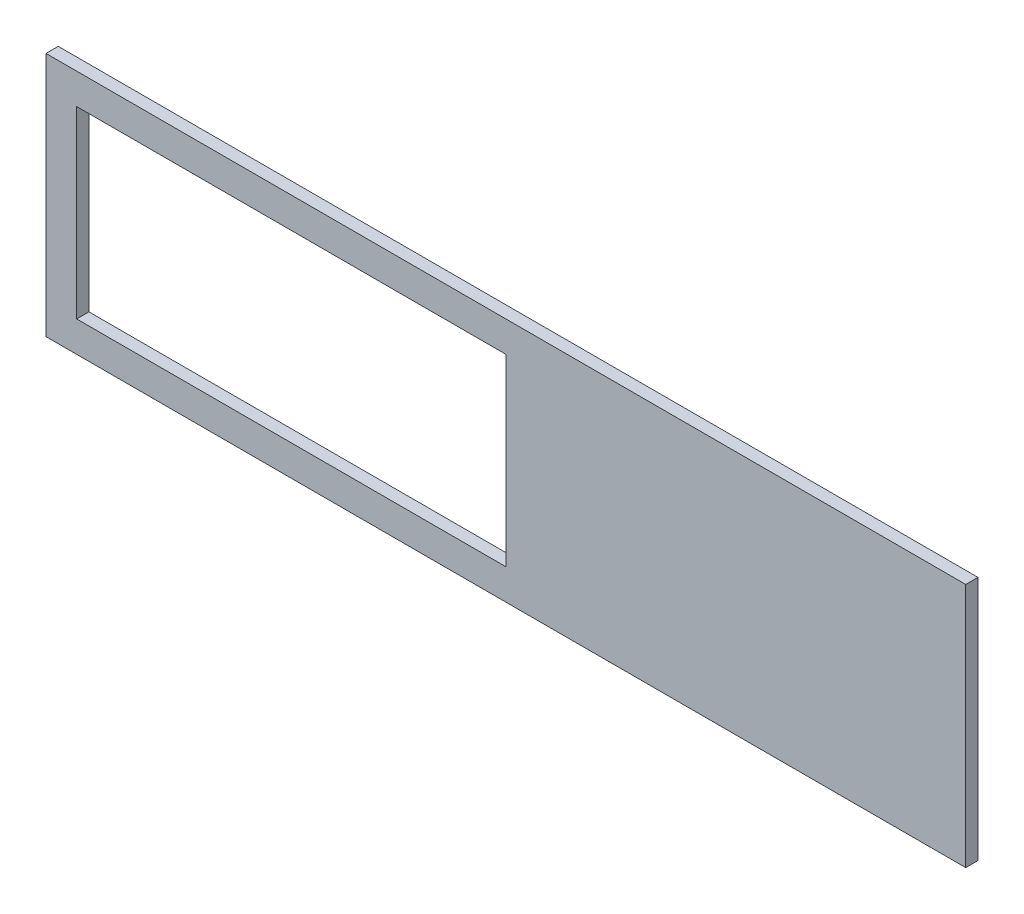
ISO-10303-21;
HEADER;
FILE_DESCRIPTION(('STEP AP214'),'2;1');
FILE_NAME('part.step','',(''),(''),'','','');
FILE_SCHEMA(('AUTOMOTIVE_DESIGN { 1 0 10303 214 1 1 1 1 }'));
ENDSEC;
DATA;
#1=APPLICATION_CONTEXT('core data for automotive mechanical design processes');
#2=APPLICATION_PROTOCOL_DEFINITION('international standard','automotive_design',2000,#1);
#3=PRODUCT_CONTEXT('',#1,'mechanical');
#4=PRODUCT('Part','Part','',(#3));
#5=PRODUCT_RELATED_PRODUCT_CATEGORY('part','',(#4));
#6=PRODUCT_DEFINITION_FORMATION('','',#4);
#7=PRODUCT_DEFINITION_CONTEXT('part definition',#1,'design');
#8=PRODUCT_DEFINITION('design','',#6,#7);
#9=PRODUCT_DEFINITION_SHAPE('','',#8);
#10=(LENGTH_UNIT() NAMED_UNIT(*) SI_UNIT(.MILLI.,.METRE.));
#11=(NAMED_UNIT(*) PLANE_ANGLE_UNIT() SI_UNIT($,.RADIAN.));
#12=(NAMED_UNIT(*) SI_UNIT($,.STERADIAN.) SOLID_ANGLE_UNIT());
#13=UNCERTAINTY_MEASURE_WITH_UNIT(LENGTH_MEASURE(1.E-05),#10,'distance_accuracy_value','');
#14=(GEOMETRIC_REPRESENTATION_CONTEXT(3) GLOBAL_UNCERTAINTY_ASSIGNED_CONTEXT((#13)) GLOBAL_UNIT_ASSIGNED_CONTEXT((#10,
#11,#12)) REPRESENTATION_CONTEXT('',''));
#15=CARTESIAN_POINT('',(0.,0.,0.));
#16=DIRECTION('',(0.,0.,1.));
#17=DIRECTION('',(1.,0.,0.));
#18=AXIS2_PLACEMENT_3D('',#15,#16,#17);
#19=CARTESIAN_POINT('',(0.,0.,4.));
#20=DIRECTION('',(0.,0.,-1.));
#21=DIRECTION('',(-1.,0.,0.));
#22=AXIS2_PLACEMENT_3D('',#19,#20,#21);
#23=PLANE('',#22);
#24=DIRECTION('',(0.,-1.,0.));
#25=VECTOR('',#24,1.);
#26=CARTESIAN_POINT('',(0.,0.,4.));
#27=LINE('',#26,#25);
#28=CARTESIAN_POINT('',(0.,80.,4.));
#29=VERTEX_POINT('',#28);
#30=CARTESIAN_POINT('',(0.,0.,4.));
#31=VERTEX_POINT('',#30);
#32=EDGE_CURVE('E159',#29,#31,#27,.T.);
#33=ORIENTED_EDGE('',*,*,#32,.T.);
#34=DIRECTION('',(1.,0.,0.));
#35=VECTOR('',#34,1.);
#36=CARTESIAN_POINT('',(0.,0.,4.));
#37=LINE('',#36,#35);
#38=CARTESIAN_POINT('',(300.,0.,4.));
#39=VERTEX_POINT('',#38);
#40=EDGE_CURVE('E163',#31,#39,#37,.T.);
#41=ORIENTED_EDGE('',*,*,#40,.T.);
#42=DIRECTION('',(0.,1.,0.));
#43=VECTOR('',#42,1.);
#44=CARTESIAN_POINT('',(300.,0.,4.));
#45=LINE('',#44,#43);
#46=CARTESIAN_POINT('',(300.,80.,4.));
#47=VERTEX_POINT('',#46);
#48=EDGE_CURVE('E167',#39,#47,#45,.T.);
#49=ORIENTED_EDGE('',*,*,#48,.T.);
#50=DIRECTION('',(-1.,0.,0.));
#51=VECTOR('',#50,1.);
#52=CARTESIAN_POINT('',(0.,80.,4.));
#53=LINE('',#52,#51);
#54=EDGE_CURVE('E170',#47,#29,#53,.T.);
#55=ORIENTED_EDGE('',*,*,#54,.T.);
#56=EDGE_LOOP('',(#33,#41,#49,#55));
#57=FACE_BOUND('',#56,.T.);
#58=DIRECTION('',(0.,-1.,0.));
#59=VECTOR('',#58,1.);
#60=CARTESIAN_POINT('',(10.,70.,4.));
#61=LINE('',#60,#59);
#62=CARTESIAN_POINT('',(10.,70.,4.));
#63=VERTEX_POINT('',#62);
#64=CARTESIAN_POINT('',(10.,10.,4.));
#65=VERTEX_POINT('',#64);
#66=EDGE_CURVE('E111',#63,#65,#61,.T.);
#67=ORIENTED_EDGE('',*,*,#66,.F.);
#68=DIRECTION('',(-1.,0.,0.));
#69=VECTOR('',#68,1.);
#70=CARTESIAN_POINT('',(10.,70.,4.));
#71=LINE('',#70,#69);
#72=CARTESIAN_POINT('',(150.,70.,4.));
#73=VERTEX_POINT('',#72);
#74=EDGE_CURVE('E137',#73,#63,#71,.T.);
#75=ORIENTED_EDGE('',*,*,#74,.F.);
#76=DIRECTION('',(0.,1.,0.));
#77=VECTOR('',#76,1.);
#78=CARTESIAN_POINT('',(150.,70.,4.));
#79=LINE('',#78,#77);
#80=CARTESIAN_POINT('',(150.,10.,4.));
#81=VERTEX_POINT('',#80);
#82=EDGE_CURVE('E133',#81,#73,#79,.T.);
#83=ORIENTED_EDGE('',*,*,#82,.F.);
#84=DIRECTION('',(1.,0.,0.));
#85=VECTOR('',#84,1.);
#86=CARTESIAN_POINT('',(10.,10.,4.));
#87=LINE('',#86,#85);
#88=EDGE_CURVE('E120',#65,#81,#87,.T.);
#89=ORIENTED_EDGE('',*,*,#88,.F.);
#90=EDGE_LOOP('',(#67,#75,#83,#89));
#91=FACE_BOUND('',#90,.T.);
#92=ADVANCED_FACE('F45',(#57,#91),#23,.F.);
#93=CARTESIAN_POINT('',(0.,0.,0.));
#94=DIRECTION('',(0.,0.,-1.));
#95=DIRECTION('',(-1.,0.,0.));
#96=AXIS2_PLACEMENT_3D('',#93,#94,#95);
#97=PLANE('',#96);
#98=DIRECTION('',(0.,-1.,0.));
#99=VECTOR('',#98,1.);
#100=CARTESIAN_POINT('',(0.,0.,0.));
#101=LINE('',#100,#99);
#102=CARTESIAN_POINT('',(0.,80.,0.));
#103=VERTEX_POINT('',#102);
#104=CARTESIAN_POINT('',(0.,0.,0.));
#105=VERTEX_POINT('',#104);
#106=EDGE_CURVE('E129',#103,#105,#101,.T.);
#107=ORIENTED_EDGE('',*,*,#106,.F.);
#108=DIRECTION('',(-1.,0.,0.));
#109=VECTOR('',#108,1.);
#110=CARTESIAN_POINT('',(0.,80.,0.));
#111=LINE('',#110,#109);
#112=CARTESIAN_POINT('',(300.,80.,0.));
#113=VERTEX_POINT('',#112);
#114=EDGE_CURVE('E164',#113,#103,#111,.T.);
#115=ORIENTED_EDGE('',*,*,#114,.F.);
#116=DIRECTION('',(0.,1.,0.));
#117=VECTOR('',#116,1.);
#118=CARTESIAN_POINT('',(300.,0.,0.));
#119=LINE('',#118,#117);
#120=CARTESIAN_POINT('',(300.,0.,0.));
#121=VERTEX_POINT('',#120);
#122=EDGE_CURVE('E180',#121,#113,#119,.T.);
#123=ORIENTED_EDGE('',*,*,#122,.F.);
#124=DIRECTION('',(1.,0.,0.));
#125=VECTOR('',#124,1.);
#126=CARTESIAN_POINT('',(0.,0.,0.));
#127=LINE('',#126,#125);
#128=EDGE_CURVE('E177',#105,#121,#127,.T.);
#129=ORIENTED_EDGE('',*,*,#128,.F.);
#130=EDGE_LOOP('',(#107,#115,#123,#129));
#131=FACE_BOUND('',#130,.T.);
#132=DIRECTION('',(-1.,0.,0.));
#133=VECTOR('',#132,1.);
#134=CARTESIAN_POINT('',(10.,70.,0.));
#135=LINE('',#134,#133);
#136=CARTESIAN_POINT('',(150.,70.,0.));
#137=VERTEX_POINT('',#136);
#138=CARTESIAN_POINT('',(10.,70.,0.));
#139=VERTEX_POINT('',#138);
#140=EDGE_CURVE('E121',#137,#139,#135,.T.);
#141=ORIENTED_EDGE('',*,*,#140,.T.);
#142=DIRECTION('',(0.,-1.,0.));
#143=VECTOR('',#142,1.);
#144=CARTESIAN_POINT('',(10.,70.,0.));
#145=LINE('',#144,#143);
#146=CARTESIAN_POINT('',(10.,10.,0.));
#147=VERTEX_POINT('',#146);
#148=EDGE_CURVE('E69',#139,#147,#145,.T.);
#149=ORIENTED_EDGE('',*,*,#148,.T.);
#150=DIRECTION('',(1.,0.,0.));
#151=VECTOR('',#150,1.);
#152=CARTESIAN_POINT('',(10.,10.,0.));
#153=LINE('',#152,#151);
#154=CARTESIAN_POINT('',(150.,10.,0.));
#155=VERTEX_POINT('',#154);
#156=EDGE_CURVE('E127',#147,#155,#153,.T.);
#157=ORIENTED_EDGE('',*,*,#156,.T.);
#158=DIRECTION('',(0.,1.,0.));
#159=VECTOR('',#158,1.);
#160=CARTESIAN_POINT('',(150.,70.,0.));
#161=LINE('',#160,#159);
#162=EDGE_CURVE('E146',#155,#137,#161,.T.);
#163=ORIENTED_EDGE('',*,*,#162,.T.);
#164=EDGE_LOOP('',(#141,#149,#157,#163));
#165=FACE_BOUND('',#164,.T.);
#166=ADVANCED_FACE('F203',(#131,#165),#97,.T.);
#167=CARTESIAN_POINT('',(0.,0.,4.));
#168=DIRECTION('',(1.,0.,0.));
#169=DIRECTION('',(0.,0.,-1.));
#170=AXIS2_PLACEMENT_3D('',#167,#168,#169);
#171=PLANE('',#170);
#172=ORIENTED_EDGE('',*,*,#106,.T.);
#173=DIRECTION('',(0.,0.,-1.));
#174=VECTOR('',#173,1.);
#175=CARTESIAN_POINT('',(0.,0.,4.));
#176=LINE('',#175,#174);
#177=EDGE_CURVE('E11',#31,#105,#176,.T.);
#178=ORIENTED_EDGE('',*,*,#177,.F.);
#179=ORIENTED_EDGE('',*,*,#32,.F.);
#180=DIRECTION('',(0.,0.,-1.));
#181=VECTOR('',#180,1.);
#182=CARTESIAN_POINT('',(0.,80.,4.));
#183=LINE('',#182,#181);
#184=EDGE_CURVE('E173',#29,#103,#183,.T.);
#185=ORIENTED_EDGE('',*,*,#184,.T.);
#186=EDGE_LOOP('',(#172,#178,#179,#185));
#187=FACE_BOUND('',#186,.T.);
#188=ADVANCED_FACE('F47',(#187),#171,.F.);
#189=CARTESIAN_POINT('',(0.,0.,4.));
#190=DIRECTION('',(0.,1.,0.));
#191=DIRECTION('',(0.,0.,1.));
#192=AXIS2_PLACEMENT_3D('',#189,#190,#191);
#193=PLANE('',#192);
#194=ORIENTED_EDGE('',*,*,#128,.T.);
#195=DIRECTION('',(0.,0.,-1.));
#196=VECTOR('',#195,1.);
#197=CARTESIAN_POINT('',(300.,0.,4.));
#198=LINE('',#197,#196);
#199=EDGE_CURVE('E54',#39,#121,#198,.T.);
#200=ORIENTED_EDGE('',*,*,#199,.F.);
#201=ORIENTED_EDGE('',*,*,#40,.F.);
#202=ORIENTED_EDGE('',*,*,#177,.T.);
#203=EDGE_LOOP('',(#194,#200,#201,#202));
#204=FACE_BOUND('',#203,.T.);
#205=ADVANCED_FACE('F213',(#204),#193,.F.);
#206=CARTESIAN_POINT('',(300.,0.,4.));
#207=DIRECTION('',(-1.,0.,0.));
#208=DIRECTION('',(0.,0.,1.));
#209=AXIS2_PLACEMENT_3D('',#206,#207,#208);
#210=PLANE('',#209);
#211=ORIENTED_EDGE('',*,*,#122,.T.);
#212=DIRECTION('',(0.,0.,-1.));
#213=VECTOR('',#212,1.);
#214=CARTESIAN_POINT('',(300.,80.,4.));
#215=LINE('',#214,#213);
#216=EDGE_CURVE('E188',#47,#113,#215,.T.);
#217=ORIENTED_EDGE('',*,*,#216,.F.);
#218=ORIENTED_EDGE('',*,*,#48,.F.);
#219=ORIENTED_EDGE('',*,*,#199,.T.);
#220=EDGE_LOOP('',(#211,#217,#218,#219));
#221=FACE_BOUND('',#220,.T.);
#222=ADVANCED_FACE('F197',(#221),#210,.F.);
#223=CARTESIAN_POINT('',(0.,80.,4.));
#224=DIRECTION('',(0.,-1.,0.));
#225=DIRECTION('',(0.,0.,-1.));
#226=AXIS2_PLACEMENT_3D('',#223,#224,#225);
#227=PLANE('',#226);
#228=ORIENTED_EDGE('',*,*,#114,.T.);
#229=ORIENTED_EDGE('',*,*,#184,.F.);
#230=ORIENTED_EDGE('',*,*,#54,.F.);
#231=ORIENTED_EDGE('',*,*,#216,.T.);
#232=EDGE_LOOP('',(#228,#229,#230,#231));
#233=FACE_BOUND('',#232,.T.);
#234=ADVANCED_FACE('F207',(#233),#227,.F.);
#235=CARTESIAN_POINT('',(10.,70.,4.));
#236=DIRECTION('',(1.,0.,0.));
#237=DIRECTION('',(0.,1.,0.));
#238=AXIS2_PLACEMENT_3D('',#235,#236,#237);
#239=PLANE('',#238);
#240=ORIENTED_EDGE('',*,*,#148,.F.);
#241=DIRECTION('',(0.,0.,-1.));
#242=VECTOR('',#241,1.);
#243=CARTESIAN_POINT('',(10.,70.,4.));
#244=LINE('',#243,#242);
#245=EDGE_CURVE('E115',#63,#139,#244,.T.);
#246=ORIENTED_EDGE('',*,*,#245,.F.);
#247=ORIENTED_EDGE('',*,*,#66,.T.);
#248=DIRECTION('',(0.,0.,-1.));
#249=VECTOR('',#248,1.);
#250=CARTESIAN_POINT('',(10.,10.,4.));
#251=LINE('',#250,#249);
#252=EDGE_CURVE('E114',#65,#147,#251,.T.);
#253=ORIENTED_EDGE('',*,*,#252,.T.);
#254=EDGE_LOOP('',(#240,#246,#247,#253));
#255=FACE_BOUND('',#254,.T.);
#256=ADVANCED_FACE('F113',(#255),#239,.T.);
#257=CARTESIAN_POINT('',(10.,10.,4.));
#258=DIRECTION('',(0.,1.,0.));
#259=DIRECTION('',(0.,0.,1.));
#260=AXIS2_PLACEMENT_3D('',#257,#258,#259);
#261=PLANE('',#260);
#262=ORIENTED_EDGE('',*,*,#156,.F.);
#263=ORIENTED_EDGE('',*,*,#252,.F.);
#264=ORIENTED_EDGE('',*,*,#88,.T.);
#265=DIRECTION('',(0.,0.,-1.));
#266=VECTOR('',#265,1.);
#267=CARTESIAN_POINT('',(150.,10.,4.));
#268=LINE('',#267,#266);
#269=EDGE_CURVE('E130',#81,#155,#268,.T.);
#270=ORIENTED_EDGE('',*,*,#269,.T.);
#271=EDGE_LOOP('',(#262,#263,#264,#270));
#272=FACE_BOUND('',#271,.T.);
#273=ADVANCED_FACE('F124',(#272),#261,.T.);
#274=CARTESIAN_POINT('',(150.,70.,4.));
#275=DIRECTION('',(-1.,0.,0.));
#276=DIRECTION('',(0.,0.,1.));
#277=AXIS2_PLACEMENT_3D('',#274,#275,#276);
#278=PLANE('',#277);
#279=ORIENTED_EDGE('',*,*,#162,.F.);
#280=ORIENTED_EDGE('',*,*,#269,.F.);
#281=ORIENTED_EDGE('',*,*,#82,.T.);
#282=DIRECTION('',(0.,0.,-1.));
#283=VECTOR('',#282,1.);
#284=CARTESIAN_POINT('',(150.,70.,4.));
#285=LINE('',#284,#283);
#286=EDGE_CURVE('E61',#73,#137,#285,.T.);
#287=ORIENTED_EDGE('',*,*,#286,.T.);
#288=EDGE_LOOP('',(#279,#280,#281,#287));
#289=FACE_BOUND('',#288,.T.);
#290=ADVANCED_FACE('F236',(#289),#278,.T.);
#291=CARTESIAN_POINT('',(10.,70.,4.));
#292=DIRECTION('',(0.,-1.,0.));
#293=DIRECTION('',(0.,0.,-1.));
#294=AXIS2_PLACEMENT_3D('',#291,#292,#293);
#295=PLANE('',#294);
#296=ORIENTED_EDGE('',*,*,#140,.F.);
#297=ORIENTED_EDGE('',*,*,#286,.F.);
#298=ORIENTED_EDGE('',*,*,#74,.T.);
#299=ORIENTED_EDGE('',*,*,#245,.T.);
#300=EDGE_LOOP('',(#296,#297,#298,#299));
#301=FACE_BOUND('',#300,.T.);
#302=ADVANCED_FACE('F240',(#301),#295,.T.);
#303=CLOSED_SHELL('',(#92,#166,#188,#205,#222,#234,#256,#273,#290,#302));
#304=MANIFOLD_SOLID_BREP('B2',#303);
#305=ADVANCED_BREP_SHAPE_REPRESENTATION('',(#18,#304),#14);
#306=SHAPE_DEFINITION_REPRESENTATION(#9,#305);
ENDSEC;
END-ISO-10303-21;
